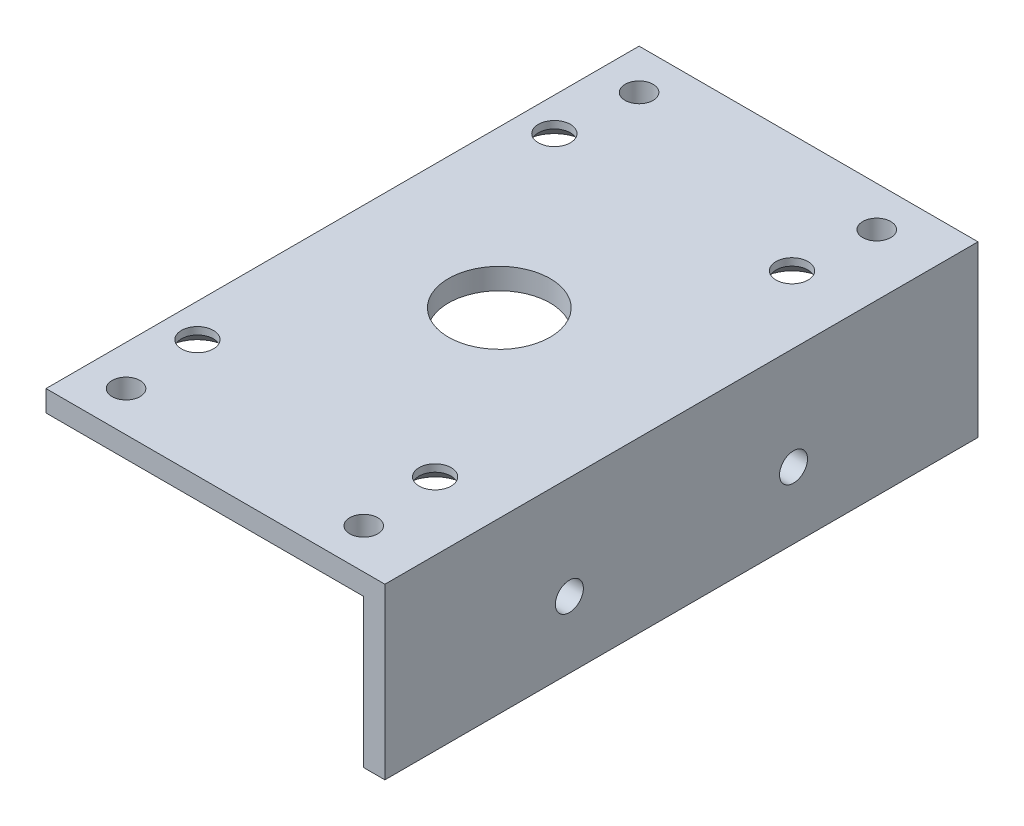
ISO-10303-21;
HEADER;
FILE_DESCRIPTION(('STEP AP214'),'2;1');
FILE_NAME('part.step','',(''),(''),'','','');
FILE_SCHEMA(('AUTOMOTIVE_DESIGN { 1 0 10303 214 1 1 1 1 }'));
ENDSEC;
DATA;
#1=APPLICATION_CONTEXT('core data for automotive mechanical design processes');
#2=APPLICATION_PROTOCOL_DEFINITION('international standard','automotive_design',2000,#1);
#3=PRODUCT_CONTEXT('',#1,'mechanical');
#4=PRODUCT('Part','Part','',(#3));
#5=PRODUCT_RELATED_PRODUCT_CATEGORY('part','',(#4));
#6=PRODUCT_DEFINITION_FORMATION('','',#4);
#7=PRODUCT_DEFINITION_CONTEXT('part definition',#1,'design');
#8=PRODUCT_DEFINITION('design','',#6,#7);
#9=PRODUCT_DEFINITION_SHAPE('','',#8);
#10=(LENGTH_UNIT() NAMED_UNIT(*) SI_UNIT(.MILLI.,.METRE.));
#11=(NAMED_UNIT(*) PLANE_ANGLE_UNIT() SI_UNIT($,.RADIAN.));
#12=(NAMED_UNIT(*) SI_UNIT($,.STERADIAN.) SOLID_ANGLE_UNIT());
#13=UNCERTAINTY_MEASURE_WITH_UNIT(LENGTH_MEASURE(1.E-05),#10,'distance_accuracy_value','');
#14=(GEOMETRIC_REPRESENTATION_CONTEXT(3) GLOBAL_UNCERTAINTY_ASSIGNED_CONTEXT((#13)) GLOBAL_UNIT_ASSIGNED_CONTEXT((#10,
#11,#12)) REPRESENTATION_CONTEXT('',''));
#15=CARTESIAN_POINT('',(0.,0.,0.));
#16=DIRECTION('',(0.,0.,1.));
#17=DIRECTION('',(1.,0.,0.));
#18=AXIS2_PLACEMENT_3D('',#15,#16,#17);
#19=CARTESIAN_POINT('',(-10.175,22.2250000000486,58.5));
#20=DIRECTION('',(0.,-1.,0.));
#21=DIRECTION('',(0.,0.,-1.));
#22=AXIS2_PLACEMENT_3D('',#19,#20,#21);
#23=CONICAL_SURFACE('',#22,4.47999999990634,0.785398163383784);
#24=CARTESIAN_POINT('',(-10.175,24.305,58.5));
#25=DIRECTION('',(0.,-1.,0.));
#26=DIRECTION('',(0.,0.,-1.));
#27=AXIS2_PLACEMENT_3D('',#24,#25,#26);
#28=CIRCLE('',#27,2.4);
#29=CARTESIAN_POINT('',(-10.175,24.305,56.1));
#30=VERTEX_POINT('',#29);
#31=EDGE_CURVE('E114',#30,#30,#28,.F.);
#32=ORIENTED_EDGE('',*,*,#31,.T.);
#33=EDGE_LOOP('',(#32));
#34=FACE_BOUND('',#33,.T.);
#35=CARTESIAN_POINT('',(-10.175,22.2249999999917,58.5));
#36=DIRECTION('',(0.,-1.,0.));
#37=DIRECTION('',(0.,0.,-1.));
#38=AXIS2_PLACEMENT_3D('',#35,#36,#37);
#39=CIRCLE('',#38,4.47999999996319);
#40=CARTESIAN_POINT('',(-10.175,22.2249999999917,54.0200000000368));
#41=VERTEX_POINT('',#40);
#42=EDGE_CURVE('E171',#41,#41,#39,.T.);
#43=ORIENTED_EDGE('',*,*,#42,.T.);
#44=EDGE_LOOP('',(#43));
#45=FACE_BOUND('',#44,.T.);
#46=ADVANCED_FACE('F17',(#34,#45),#23,.F.);
#47=CARTESIAN_POINT('',(-10.175,22.2250000000486,5.));
#48=DIRECTION('',(0.,-1.,0.));
#49=DIRECTION('',(0.,0.,-1.));
#50=AXIS2_PLACEMENT_3D('',#47,#48,#49);
#51=CONICAL_SURFACE('',#50,4.47999999994863,0.785398163397448);
#52=CARTESIAN_POINT('',(-10.175,24.305,5.));
#53=DIRECTION('',(0.,-1.,0.));
#54=DIRECTION('',(0.,0.,-1.));
#55=AXIS2_PLACEMENT_3D('',#52,#53,#54);
#56=CIRCLE('',#55,2.4);
#57=CARTESIAN_POINT('',(-10.175,24.305,2.6));
#58=VERTEX_POINT('',#57);
#59=EDGE_CURVE('E111',#58,#58,#56,.F.);
#60=ORIENTED_EDGE('',*,*,#59,.T.);
#61=EDGE_LOOP('',(#60));
#62=FACE_BOUND('',#61,.T.);
#63=CARTESIAN_POINT('',(-10.175,22.2250000000486,5.));
#64=DIRECTION('',(0.,-1.,0.));
#65=DIRECTION('',(0.,0.,-1.));
#66=AXIS2_PLACEMENT_3D('',#63,#64,#65);
#67=CIRCLE('',#66,4.47999999994863);
#68=CARTESIAN_POINT('',(-10.175,22.2250000000486,0.520000000051368));
#69=VERTEX_POINT('',#68);
#70=EDGE_CURVE('E20',#69,#69,#67,.T.);
#71=ORIENTED_EDGE('',*,*,#70,.T.);
#72=EDGE_LOOP('',(#71));
#73=FACE_BOUND('',#72,.T.);
#74=ADVANCED_FACE('F181',(#62,#73),#51,.F.);
#75=CARTESIAN_POINT('',(-45.8,22.2249999999349,5.));
#76=DIRECTION('',(0.,-1.,0.));
#77=DIRECTION('',(0.,0.,-1.));
#78=AXIS2_PLACEMENT_3D('',#75,#76,#77);
#79=CONICAL_SURFACE('',#78,4.48000000000547,0.785398163397448);
#80=CARTESIAN_POINT('',(-45.8,24.305,5.));
#81=DIRECTION('',(0.,-1.,0.));
#82=DIRECTION('',(0.,0.,-1.));
#83=AXIS2_PLACEMENT_3D('',#80,#81,#82);
#84=CIRCLE('',#83,2.4);
#85=CARTESIAN_POINT('',(-45.8,24.305,2.6));
#86=VERTEX_POINT('',#85);
#87=EDGE_CURVE('E108',#86,#86,#84,.F.);
#88=ORIENTED_EDGE('',*,*,#87,.T.);
#89=EDGE_LOOP('',(#88));
#90=FACE_BOUND('',#89,.T.);
#91=CARTESIAN_POINT('',(-45.8,22.2249999999349,5.));
#92=DIRECTION('',(0.,-1.,0.));
#93=DIRECTION('',(0.,0.,-1.));
#94=AXIS2_PLACEMENT_3D('',#91,#92,#93);
#95=CIRCLE('',#94,4.48000000000547);
#96=CARTESIAN_POINT('',(-45.8,22.2249999999349,0.519999999994525));
#97=VERTEX_POINT('',#96);
#98=EDGE_CURVE('E103',#97,#97,#95,.T.);
#99=ORIENTED_EDGE('',*,*,#98,.T.);
#100=EDGE_LOOP('',(#99));
#101=FACE_BOUND('',#100,.T.);
#102=ADVANCED_FACE('F295',(#90,#101),#79,.F.);
#103=CARTESIAN_POINT('',(-45.8,22.2250000000486,58.5));
#104=DIRECTION('',(0.,-1.,0.));
#105=DIRECTION('',(0.,0.,-1.));
#106=AXIS2_PLACEMENT_3D('',#103,#104,#105);
#107=CONICAL_SURFACE('',#106,4.47999999996319,0.785398163397448);
#108=CARTESIAN_POINT('',(-45.8,24.305,58.5));
#109=DIRECTION('',(0.,-1.,0.));
#110=DIRECTION('',(0.,0.,-1.));
#111=AXIS2_PLACEMENT_3D('',#108,#109,#110);
#112=CIRCLE('',#111,2.4);
#113=CARTESIAN_POINT('',(-45.8,24.305,56.1));
#114=VERTEX_POINT('',#113);
#115=EDGE_CURVE('E105',#114,#114,#112,.F.);
#116=ORIENTED_EDGE('',*,*,#115,.T.);
#117=EDGE_LOOP('',(#116));
#118=FACE_BOUND('',#117,.T.);
#119=CARTESIAN_POINT('',(-45.8,22.2249999999917,58.5));
#120=DIRECTION('',(0.,-1.,0.));
#121=DIRECTION('',(0.,0.,-1.));
#122=AXIS2_PLACEMENT_3D('',#119,#120,#121);
#123=CIRCLE('',#122,4.48000000002003);
#124=CARTESIAN_POINT('',(-45.8,22.2249999999917,54.01999999998));
#125=VERTEX_POINT('',#124);
#126=EDGE_CURVE('E104',#125,#125,#123,.T.);
#127=ORIENTED_EDGE('',*,*,#126,.T.);
#128=EDGE_LOOP('',(#127));
#129=FACE_BOUND('',#128,.T.);
#130=ADVANCED_FACE('F300',(#118,#129),#107,.F.);
#131=CARTESIAN_POINT('',(-3.175,0.,63.5));
#132=DIRECTION('',(1.,0.,0.));
#133=DIRECTION('',(0.,0.,-1.));
#134=AXIS2_PLACEMENT_3D('',#131,#132,#133);
#135=PLANE('',#134);
#136=DIRECTION('',(0.,1.,0.));
#137=VECTOR('',#136,1.);
#138=CARTESIAN_POINT('',(-3.175,0.,-12.7));
#139=LINE('',#138,#137);
#140=CARTESIAN_POINT('',(-3.175,0.,-12.7));
#141=VERTEX_POINT('',#140);
#142=CARTESIAN_POINT('',(-3.175,22.225,-12.7));
#143=VERTEX_POINT('',#142);
#144=EDGE_CURVE('E88',#141,#143,#139,.T.);
#145=ORIENTED_EDGE('',*,*,#144,.F.);
#146=DIRECTION('',(0.,0.,1.));
#147=VECTOR('',#146,1.);
#148=CARTESIAN_POINT('',(-3.175,0.,63.5));
#149=LINE('',#148,#147);
#150=CARTESIAN_POINT('',(-3.175,0.,76.2));
#151=VERTEX_POINT('',#150);
#152=EDGE_CURVE('E85',#141,#151,#149,.T.);
#153=ORIENTED_EDGE('',*,*,#152,.T.);
#154=DIRECTION('',(0.,1.,0.));
#155=VECTOR('',#154,1.);
#156=CARTESIAN_POINT('',(-3.175,0.,76.2));
#157=LINE('',#156,#155);
#158=CARTESIAN_POINT('',(-3.175,22.225,76.2));
#159=VERTEX_POINT('',#158);
#160=EDGE_CURVE('E72',#159,#151,#157,.F.);
#161=ORIENTED_EDGE('',*,*,#160,.F.);
#162=DIRECTION('',(0.,0.,1.));
#163=VECTOR('',#162,1.);
#164=CARTESIAN_POINT('',(-3.175,22.225,63.5));
#165=LINE('',#164,#163);
#166=EDGE_CURVE('E67',#159,#143,#165,.F.);
#167=ORIENTED_EDGE('',*,*,#166,.T.);
#168=EDGE_LOOP('',(#145,#153,#161,#167));
#169=FACE_BOUND('',#168,.T.);
#170=CARTESIAN_POINT('',(-3.175,10.,14.95));
#171=DIRECTION('',(-1.,0.,0.));
#172=DIRECTION('',(0.,0.,1.));
#173=AXIS2_PLACEMENT_3D('',#170,#171,#172);
#174=CIRCLE('',#173,2.1);
#175=CARTESIAN_POINT('',(-3.175,10.,17.05));
#176=VERTEX_POINT('',#175);
#177=EDGE_CURVE('E92',#176,#176,#174,.F.);
#178=ORIENTED_EDGE('',*,*,#177,.T.);
#179=EDGE_LOOP('',(#178));
#180=FACE_BOUND('',#179,.T.);
#181=CARTESIAN_POINT('',(-3.175,10.,48.55));
#182=DIRECTION('',(-1.,0.,0.));
#183=DIRECTION('',(0.,0.,1.));
#184=AXIS2_PLACEMENT_3D('',#181,#182,#183);
#185=CIRCLE('',#184,2.1);
#186=CARTESIAN_POINT('',(-3.175,10.,50.65));
#187=VERTEX_POINT('',#186);
#188=EDGE_CURVE('E168',#187,#187,#185,.F.);
#189=ORIENTED_EDGE('',*,*,#188,.T.);
#190=EDGE_LOOP('',(#189));
#191=FACE_BOUND('',#190,.T.);
#192=ADVANCED_FACE('F86',(#169,#180,#191),#135,.F.);
#193=CARTESIAN_POINT('',(-3.175,22.225,63.5));
#194=DIRECTION('',(0.,1.,0.));
#195=DIRECTION('',(-1.,0.,0.));
#196=AXIS2_PLACEMENT_3D('',#193,#194,#195);
#197=PLANE('',#196);
#198=CARTESIAN_POINT('',(-44.8,22.225,-6.69999999999997));
#199=DIRECTION('',(0.,-1.,0.));
#200=DIRECTION('',(0.,0.,-1.));
#201=AXIS2_PLACEMENT_3D('',#198,#199,#200);
#202=CIRCLE('',#201,2.1);
#203=CARTESIAN_POINT('',(-44.8,22.225,-8.79999999999997));
#204=VERTEX_POINT('',#203);
#205=EDGE_CURVE('E91',#204,#204,#202,.F.);
#206=ORIENTED_EDGE('',*,*,#205,.T.);
#207=EDGE_LOOP('',(#206));
#208=FACE_BOUND('',#207,.T.);
#209=CARTESIAN_POINT('',(-9.17500000000002,22.225,70.2));
#210=DIRECTION('',(0.,-1.,0.));
#211=DIRECTION('',(0.,0.,-1.));
#212=AXIS2_PLACEMENT_3D('',#209,#210,#211);
#213=CIRCLE('',#212,2.1);
#214=CARTESIAN_POINT('',(-9.17500000000002,22.225,68.1));
#215=VERTEX_POINT('',#214);
#216=EDGE_CURVE('E158',#215,#215,#213,.F.);
#217=ORIENTED_EDGE('',*,*,#216,.T.);
#218=EDGE_LOOP('',(#217));
#219=FACE_BOUND('',#218,.T.);
#220=ORIENTED_EDGE('',*,*,#42,.F.);
#221=EDGE_LOOP('',(#220));
#222=FACE_BOUND('',#221,.T.);
#223=ORIENTED_EDGE('',*,*,#98,.F.);
#224=EDGE_LOOP('',(#223));
#225=FACE_BOUND('',#224,.T.);
#226=DIRECTION('',(-1.,0.,0.));
#227=VECTOR('',#226,1.);
#228=CARTESIAN_POINT('',(0.,22.225,-12.7));
#229=LINE('',#228,#227);
#230=CARTESIAN_POINT('',(-50.8,22.225,-12.7));
#231=VERTEX_POINT('',#230);
#232=EDGE_CURVE('E274',#143,#231,#229,.T.);
#233=ORIENTED_EDGE('',*,*,#232,.F.);
#234=ORIENTED_EDGE('',*,*,#166,.F.);
#235=DIRECTION('',(1.,0.,0.));
#236=VECTOR('',#235,1.);
#237=CARTESIAN_POINT('',(0.,22.225,76.2));
#238=LINE('',#237,#236);
#239=CARTESIAN_POINT('',(-50.8,22.225,76.2));
#240=VERTEX_POINT('',#239);
#241=EDGE_CURVE('E80',#240,#159,#238,.T.);
#242=ORIENTED_EDGE('',*,*,#241,.F.);
#243=DIRECTION('',(0.,0.,-1.));
#244=VECTOR('',#243,1.);
#245=CARTESIAN_POINT('',(-50.8,22.225,63.5));
#246=LINE('',#245,#244);
#247=EDGE_CURVE('E469',#240,#231,#246,.T.);
#248=ORIENTED_EDGE('',*,*,#247,.T.);
#249=EDGE_LOOP('',(#233,#234,#242,#248));
#250=FACE_BOUND('',#249,.T.);
#251=CARTESIAN_POINT('',(-27.305,22.225,31.75));
#252=DIRECTION('',(0.,-1.,0.));
#253=DIRECTION('',(1.,0.,0.));
#254=AXIS2_PLACEMENT_3D('',#251,#252,#253);
#255=CIRCLE('',#254,7.61999999999999);
#256=CARTESIAN_POINT('',(-19.685,22.225,31.75));
#257=VERTEX_POINT('',#256);
#258=EDGE_CURVE('E82',#257,#257,#255,.F.);
#259=ORIENTED_EDGE('',*,*,#258,.T.);
#260=EDGE_LOOP('',(#259));
#261=FACE_BOUND('',#260,.T.);
#262=ORIENTED_EDGE('',*,*,#126,.F.);
#263=EDGE_LOOP('',(#262));
#264=FACE_BOUND('',#263,.T.);
#265=ORIENTED_EDGE('',*,*,#70,.F.);
#266=EDGE_LOOP('',(#265));
#267=FACE_BOUND('',#266,.T.);
#268=CARTESIAN_POINT('',(-9.17500000000001,22.225,-6.69999999999995));
#269=DIRECTION('',(0.,-1.,0.));
#270=DIRECTION('',(0.,0.,-1.));
#271=AXIS2_PLACEMENT_3D('',#268,#269,#270);
#272=CIRCLE('',#271,2.1);
#273=CARTESIAN_POINT('',(-9.17500000000001,22.225,-8.79999999999995));
#274=VERTEX_POINT('',#273);
#275=EDGE_CURVE('E117',#274,#274,#272,.F.);
#276=ORIENTED_EDGE('',*,*,#275,.T.);
#277=EDGE_LOOP('',(#276));
#278=FACE_BOUND('',#277,.T.);
#279=CARTESIAN_POINT('',(-44.8,22.225,70.2));
#280=DIRECTION('',(0.,-1.,0.));
#281=DIRECTION('',(0.,0.,-1.));
#282=AXIS2_PLACEMENT_3D('',#279,#280,#281);
#283=CIRCLE('',#282,2.1);
#284=CARTESIAN_POINT('',(-44.8,22.225,68.1));
#285=VERTEX_POINT('',#284);
#286=EDGE_CURVE('E161',#285,#285,#283,.F.);
#287=ORIENTED_EDGE('',*,*,#286,.T.);
#288=EDGE_LOOP('',(#287));
#289=FACE_BOUND('',#288,.T.);
#290=ADVANCED_FACE('F183',(#208,#219,#222,#225,#250,#261,#264,#267,#278,#289),#197,.F.);
#291=CARTESIAN_POINT('',(-3.175,10.,48.55));
#292=DIRECTION('',(-1.,0.,0.));
#293=DIRECTION('',(0.,0.,1.));
#294=AXIS2_PLACEMENT_3D('',#291,#292,#293);
#295=CYLINDRICAL_SURFACE('',#294,2.1);
#296=CARTESIAN_POINT('',(0.,10.,48.55));
#297=DIRECTION('',(-1.,0.,0.));
#298=DIRECTION('',(0.,0.,1.));
#299=AXIS2_PLACEMENT_3D('',#296,#297,#298);
#300=CIRCLE('',#299,2.1);
#301=CARTESIAN_POINT('',(0.,10.,50.65));
#302=VERTEX_POINT('',#301);
#303=EDGE_CURVE('E150',#302,#302,#300,.F.);
#304=ORIENTED_EDGE('',*,*,#303,.T.);
#305=EDGE_LOOP('',(#304));
#306=FACE_BOUND('',#305,.T.);
#307=ORIENTED_EDGE('',*,*,#188,.F.);
#308=EDGE_LOOP('',(#307));
#309=FACE_BOUND('',#308,.T.);
#310=ADVANCED_FACE('F186',(#306,#309),#295,.F.);
#311=CARTESIAN_POINT('',(-3.175,10.,14.95));
#312=DIRECTION('',(-1.,0.,0.));
#313=DIRECTION('',(0.,0.,1.));
#314=AXIS2_PLACEMENT_3D('',#311,#312,#313);
#315=CYLINDRICAL_SURFACE('',#314,2.1);
#316=CARTESIAN_POINT('',(0.,10.,14.95));
#317=DIRECTION('',(-1.,0.,0.));
#318=DIRECTION('',(0.,0.,1.));
#319=AXIS2_PLACEMENT_3D('',#316,#317,#318);
#320=CIRCLE('',#319,2.1);
#321=CARTESIAN_POINT('',(0.,10.,17.05));
#322=VERTEX_POINT('',#321);
#323=EDGE_CURVE('E146',#322,#322,#320,.F.);
#324=ORIENTED_EDGE('',*,*,#323,.T.);
#325=EDGE_LOOP('',(#324));
#326=FACE_BOUND('',#325,.T.);
#327=ORIENTED_EDGE('',*,*,#177,.F.);
#328=EDGE_LOOP('',(#327));
#329=FACE_BOUND('',#328,.T.);
#330=ADVANCED_FACE('F311',(#326,#329),#315,.F.);
#331=CARTESIAN_POINT('',(0.,0.,63.5));
#332=DIRECTION('',(0.,1.,0.));
#333=DIRECTION('',(-1.,0.,0.));
#334=AXIS2_PLACEMENT_3D('',#331,#332,#333);
#335=PLANE('',#334);
#336=DIRECTION('',(-1.,0.,0.));
#337=VECTOR('',#336,1.);
#338=CARTESIAN_POINT('',(0.,0.,-12.7));
#339=LINE('',#338,#337);
#340=CARTESIAN_POINT('',(0.,0.,-12.7));
#341=VERTEX_POINT('',#340);
#342=EDGE_CURVE('E473',#341,#141,#339,.T.);
#343=ORIENTED_EDGE('',*,*,#342,.F.);
#344=DIRECTION('',(0.,0.,1.));
#345=VECTOR('',#344,1.);
#346=CARTESIAN_POINT('',(0.,0.,63.5));
#347=LINE('',#346,#345);
#348=CARTESIAN_POINT('',(0.,0.,76.2));
#349=VERTEX_POINT('',#348);
#350=EDGE_CURVE('E96',#341,#349,#347,.T.);
#351=ORIENTED_EDGE('',*,*,#350,.T.);
#352=DIRECTION('',(1.,0.,0.));
#353=VECTOR('',#352,1.);
#354=CARTESIAN_POINT('',(0.,0.,76.2));
#355=LINE('',#354,#353);
#356=EDGE_CURVE('E78',#151,#349,#355,.T.);
#357=ORIENTED_EDGE('',*,*,#356,.F.);
#358=ORIENTED_EDGE('',*,*,#152,.F.);
#359=EDGE_LOOP('',(#343,#351,#357,#358));
#360=FACE_BOUND('',#359,.T.);
#361=ADVANCED_FACE('F95',(#360),#335,.F.);
#362=CARTESIAN_POINT('',(-44.8,22.225,-6.69999999999997));
#363=DIRECTION('',(0.,-1.,0.));
#364=DIRECTION('',(0.,0.,-1.));
#365=AXIS2_PLACEMENT_3D('',#362,#363,#364);
#366=CYLINDRICAL_SURFACE('',#365,2.1);
#367=CARTESIAN_POINT('',(-44.8,25.4,-6.69999999999997));
#368=DIRECTION('',(0.,-1.,0.));
#369=DIRECTION('',(0.,0.,-1.));
#370=AXIS2_PLACEMENT_3D('',#367,#368,#369);
#371=CIRCLE('',#370,2.1);
#372=CARTESIAN_POINT('',(-44.8,25.4,-8.79999999999997));
#373=VERTEX_POINT('',#372);
#374=EDGE_CURVE('E143',#373,#373,#371,.F.);
#375=ORIENTED_EDGE('',*,*,#374,.T.);
#376=EDGE_LOOP('',(#375));
#377=FACE_BOUND('',#376,.T.);
#378=ORIENTED_EDGE('',*,*,#205,.F.);
#379=EDGE_LOOP('',(#378));
#380=FACE_BOUND('',#379,.T.);
#381=ADVANCED_FACE('F196',(#377,#380),#366,.F.);
#382=CARTESIAN_POINT('',(-44.8,22.225,70.2));
#383=DIRECTION('',(0.,-1.,0.));
#384=DIRECTION('',(0.,0.,-1.));
#385=AXIS2_PLACEMENT_3D('',#382,#383,#384);
#386=CYLINDRICAL_SURFACE('',#385,2.1);
#387=CARTESIAN_POINT('',(-44.8,25.4,70.2));
#388=DIRECTION('',(0.,-1.,0.));
#389=DIRECTION('',(0.,0.,-1.));
#390=AXIS2_PLACEMENT_3D('',#387,#388,#389);
#391=CIRCLE('',#390,2.1);
#392=CARTESIAN_POINT('',(-44.8,25.4,68.1));
#393=VERTEX_POINT('',#392);
#394=EDGE_CURVE('E140',#393,#393,#391,.F.);
#395=ORIENTED_EDGE('',*,*,#394,.T.);
#396=EDGE_LOOP('',(#395));
#397=FACE_BOUND('',#396,.T.);
#398=ORIENTED_EDGE('',*,*,#286,.F.);
#399=EDGE_LOOP('',(#398));
#400=FACE_BOUND('',#399,.T.);
#401=ADVANCED_FACE('F193',(#397,#400),#386,.F.);
#402=CARTESIAN_POINT('',(-9.17500000000002,22.225,70.2));
#403=DIRECTION('',(0.,-1.,0.));
#404=DIRECTION('',(0.,0.,-1.));
#405=AXIS2_PLACEMENT_3D('',#402,#403,#404);
#406=CYLINDRICAL_SURFACE('',#405,2.1);
#407=CARTESIAN_POINT('',(-9.17500000000002,25.4,70.2));
#408=DIRECTION('',(0.,-1.,0.));
#409=DIRECTION('',(0.,0.,-1.));
#410=AXIS2_PLACEMENT_3D('',#407,#408,#409);
#411=CIRCLE('',#410,2.1);
#412=CARTESIAN_POINT('',(-9.17500000000002,25.4,68.1));
#413=VERTEX_POINT('',#412);
#414=EDGE_CURVE('E137',#413,#413,#411,.F.);
#415=ORIENTED_EDGE('',*,*,#414,.T.);
#416=EDGE_LOOP('',(#415));
#417=FACE_BOUND('',#416,.T.);
#418=ORIENTED_EDGE('',*,*,#216,.F.);
#419=EDGE_LOOP('',(#418));
#420=FACE_BOUND('',#419,.T.);
#421=ADVANCED_FACE('F195',(#417,#420),#406,.F.);
#422=CARTESIAN_POINT('',(-9.17500000000001,22.225,-6.69999999999995));
#423=DIRECTION('',(0.,-1.,0.));
#424=DIRECTION('',(0.,0.,-1.));
#425=AXIS2_PLACEMENT_3D('',#422,#423,#424);
#426=CYLINDRICAL_SURFACE('',#425,2.1);
#427=CARTESIAN_POINT('',(-9.17500000000001,25.4,-6.69999999999995));
#428=DIRECTION('',(0.,-1.,0.));
#429=DIRECTION('',(0.,0.,-1.));
#430=AXIS2_PLACEMENT_3D('',#427,#428,#429);
#431=CIRCLE('',#430,2.1);
#432=CARTESIAN_POINT('',(-9.17500000000001,25.4,-8.79999999999995));
#433=VERTEX_POINT('',#432);
#434=EDGE_CURVE('E134',#433,#433,#431,.F.);
#435=ORIENTED_EDGE('',*,*,#434,.T.);
#436=EDGE_LOOP('',(#435));
#437=FACE_BOUND('',#436,.T.);
#438=ORIENTED_EDGE('',*,*,#275,.F.);
#439=EDGE_LOOP('',(#438));
#440=FACE_BOUND('',#439,.T.);
#441=ADVANCED_FACE('F204',(#437,#440),#426,.F.);
#442=CARTESIAN_POINT('',(-10.175,22.225,58.5));
#443=DIRECTION('',(0.,-1.,0.));
#444=DIRECTION('',(0.,0.,-1.));
#445=AXIS2_PLACEMENT_3D('',#442,#443,#444);
#446=CYLINDRICAL_SURFACE('',#445,2.4);
#447=CARTESIAN_POINT('',(-10.175,25.4,58.5));
#448=DIRECTION('',(0.,-1.,0.));
#449=DIRECTION('',(0.,0.,-1.));
#450=AXIS2_PLACEMENT_3D('',#447,#448,#449);
#451=CIRCLE('',#450,2.4);
#452=CARTESIAN_POINT('',(-10.175,25.4,56.1));
#453=VERTEX_POINT('',#452);
#454=EDGE_CURVE('E131',#453,#453,#451,.F.);
#455=ORIENTED_EDGE('',*,*,#454,.T.);
#456=EDGE_LOOP('',(#455));
#457=FACE_BOUND('',#456,.T.);
#458=ORIENTED_EDGE('',*,*,#31,.F.);
#459=EDGE_LOOP('',(#458));
#460=FACE_BOUND('',#459,.T.);
#461=ADVANCED_FACE('F246',(#457,#460),#446,.F.);
#462=CARTESIAN_POINT('',(-10.175,22.225,5.));
#463=DIRECTION('',(0.,-1.,0.));
#464=DIRECTION('',(0.,0.,-1.));
#465=AXIS2_PLACEMENT_3D('',#462,#463,#464);
#466=CYLINDRICAL_SURFACE('',#465,2.4);
#467=CARTESIAN_POINT('',(-10.175,25.4,5.));
#468=DIRECTION('',(0.,-1.,0.));
#469=DIRECTION('',(0.,0.,-1.));
#470=AXIS2_PLACEMENT_3D('',#467,#468,#469);
#471=CIRCLE('',#470,2.4);
#472=CARTESIAN_POINT('',(-10.175,25.4,2.6));
#473=VERTEX_POINT('',#472);
#474=EDGE_CURVE('E128',#473,#473,#471,.F.);
#475=ORIENTED_EDGE('',*,*,#474,.T.);
#476=EDGE_LOOP('',(#475));
#477=FACE_BOUND('',#476,.T.);
#478=ORIENTED_EDGE('',*,*,#59,.F.);
#479=EDGE_LOOP('',(#478));
#480=FACE_BOUND('',#479,.T.);
#481=ADVANCED_FACE('F242',(#477,#480),#466,.F.);
#482=CARTESIAN_POINT('',(-45.8,22.225,5.));
#483=DIRECTION('',(0.,-1.,0.));
#484=DIRECTION('',(0.,0.,-1.));
#485=AXIS2_PLACEMENT_3D('',#482,#483,#484);
#486=CYLINDRICAL_SURFACE('',#485,2.4);
#487=CARTESIAN_POINT('',(-45.8,25.4,5.));
#488=DIRECTION('',(0.,-1.,0.));
#489=DIRECTION('',(0.,0.,-1.));
#490=AXIS2_PLACEMENT_3D('',#487,#488,#489);
#491=CIRCLE('',#490,2.4);
#492=CARTESIAN_POINT('',(-45.8,25.4,2.6));
#493=VERTEX_POINT('',#492);
#494=EDGE_CURVE('E125',#493,#493,#491,.F.);
#495=ORIENTED_EDGE('',*,*,#494,.T.);
#496=EDGE_LOOP('',(#495));
#497=FACE_BOUND('',#496,.T.);
#498=ORIENTED_EDGE('',*,*,#87,.F.);
#499=EDGE_LOOP('',(#498));
#500=FACE_BOUND('',#499,.T.);
#501=ADVANCED_FACE('F238',(#497,#500),#486,.F.);
#502=CARTESIAN_POINT('',(-45.8,22.225,58.5));
#503=DIRECTION('',(0.,-1.,0.));
#504=DIRECTION('',(0.,0.,-1.));
#505=AXIS2_PLACEMENT_3D('',#502,#503,#504);
#506=CYLINDRICAL_SURFACE('',#505,2.4);
#507=CARTESIAN_POINT('',(-45.8,25.4,58.5));
#508=DIRECTION('',(0.,-1.,0.));
#509=DIRECTION('',(0.,0.,-1.));
#510=AXIS2_PLACEMENT_3D('',#507,#508,#509);
#511=CIRCLE('',#510,2.4);
#512=CARTESIAN_POINT('',(-45.8,25.4,56.1));
#513=VERTEX_POINT('',#512);
#514=EDGE_CURVE('E122',#513,#513,#511,.F.);
#515=ORIENTED_EDGE('',*,*,#514,.T.);
#516=EDGE_LOOP('',(#515));
#517=FACE_BOUND('',#516,.T.);
#518=ORIENTED_EDGE('',*,*,#115,.F.);
#519=EDGE_LOOP('',(#518));
#520=FACE_BOUND('',#519,.T.);
#521=ADVANCED_FACE('F234',(#517,#520),#506,.F.);
#522=CARTESIAN_POINT('',(-27.305,25.401,31.75));
#523=DIRECTION('',(0.,-1.,0.));
#524=DIRECTION('',(1.,0.,0.));
#525=AXIS2_PLACEMENT_3D('',#522,#523,#524);
#526=CYLINDRICAL_SURFACE('',#525,7.61999999999999);
#527=ORIENTED_EDGE('',*,*,#258,.F.);
#528=EDGE_LOOP('',(#527));
#529=FACE_BOUND('',#528,.T.);
#530=CARTESIAN_POINT('',(-27.305,25.4,31.75));
#531=DIRECTION('',(0.,-1.,0.));
#532=DIRECTION('',(1.,0.,0.));
#533=AXIS2_PLACEMENT_3D('',#530,#531,#532);
#534=CIRCLE('',#533,7.61999999999999);
#535=CARTESIAN_POINT('',(-19.685,25.4,31.75));
#536=VERTEX_POINT('',#535);
#537=EDGE_CURVE('E118',#536,#536,#534,.F.);
#538=ORIENTED_EDGE('',*,*,#537,.T.);
#539=EDGE_LOOP('',(#538));
#540=FACE_BOUND('',#539,.T.);
#541=ADVANCED_FACE('F231',(#529,#540),#526,.F.);
#542=CARTESIAN_POINT('',(0.,0.,76.2));
#543=DIRECTION('',(0.,0.,1.));
#544=DIRECTION('',(1.,0.,0.));
#545=AXIS2_PLACEMENT_3D('',#542,#543,#544);
#546=PLANE('',#545);
#547=DIRECTION('',(0.,1.,0.));
#548=VECTOR('',#547,1.);
#549=CARTESIAN_POINT('',(-50.8,25.4,76.2));
#550=LINE('',#549,#548);
#551=CARTESIAN_POINT('',(-50.8,25.4,76.2));
#552=VERTEX_POINT('',#551);
#553=EDGE_CURVE('E98',#552,#240,#550,.F.);
#554=ORIENTED_EDGE('',*,*,#553,.T.);
#555=ORIENTED_EDGE('',*,*,#241,.T.);
#556=ORIENTED_EDGE('',*,*,#160,.T.);
#557=ORIENTED_EDGE('',*,*,#356,.T.);
#558=DIRECTION('',(0.,1.,0.));
#559=VECTOR('',#558,1.);
#560=CARTESIAN_POINT('',(0.,0.,76.2));
#561=LINE('',#560,#559);
#562=CARTESIAN_POINT('',(0.,25.4,76.2));
#563=VERTEX_POINT('',#562);
#564=EDGE_CURVE('E149',#349,#563,#561,.T.);
#565=ORIENTED_EDGE('',*,*,#564,.T.);
#566=DIRECTION('',(1.,0.,0.));
#567=VECTOR('',#566,1.);
#568=CARTESIAN_POINT('',(0.,25.4,76.2));
#569=LINE('',#568,#567);
#570=EDGE_CURVE('E121',#563,#552,#569,.F.);
#571=ORIENTED_EDGE('',*,*,#570,.T.);
#572=EDGE_LOOP('',(#554,#555,#556,#557,#565,#571));
#573=FACE_BOUND('',#572,.T.);
#574=ADVANCED_FACE('F75',(#573),#546,.T.);
#575=CARTESIAN_POINT('',(-50.8,25.4,63.5));
#576=DIRECTION('',(1.,0.,0.));
#577=DIRECTION('',(0.,0.,-1.));
#578=AXIS2_PLACEMENT_3D('',#575,#576,#577);
#579=PLANE('',#578);
#580=DIRECTION('',(0.,1.,0.));
#581=VECTOR('',#580,1.);
#582=CARTESIAN_POINT('',(-50.8,0.,-12.7));
#583=LINE('',#582,#581);
#584=CARTESIAN_POINT('',(-50.8,25.4,-12.7));
#585=VERTEX_POINT('',#584);
#586=EDGE_CURVE('E153',#231,#585,#583,.T.);
#587=ORIENTED_EDGE('',*,*,#586,.F.);
#588=ORIENTED_EDGE('',*,*,#247,.F.);
#589=ORIENTED_EDGE('',*,*,#553,.F.);
#590=DIRECTION('',(0.,0.,1.));
#591=VECTOR('',#590,1.);
#592=CARTESIAN_POINT('',(-50.8,25.4,63.5));
#593=LINE('',#592,#591);
#594=EDGE_CURVE('E481',#552,#585,#593,.F.);
#595=ORIENTED_EDGE('',*,*,#594,.T.);
#596=EDGE_LOOP('',(#587,#588,#589,#595));
#597=FACE_BOUND('',#596,.T.);
#598=ADVANCED_FACE('F224',(#597),#579,.F.);
#599=CARTESIAN_POINT('',(0.,0.,-12.7));
#600=DIRECTION('',(0.,0.,-1.));
#601=DIRECTION('',(-1.,0.,0.));
#602=AXIS2_PLACEMENT_3D('',#599,#600,#601);
#603=PLANE('',#602);
#604=ORIENTED_EDGE('',*,*,#586,.T.);
#605=DIRECTION('',(1.,0.,0.));
#606=VECTOR('',#605,1.);
#607=CARTESIAN_POINT('',(0.,25.4,-12.7));
#608=LINE('',#607,#606);
#609=CARTESIAN_POINT('',(0.,25.4,-12.7));
#610=VERTEX_POINT('',#609);
#611=EDGE_CURVE('E26',#585,#610,#608,.T.);
#612=ORIENTED_EDGE('',*,*,#611,.T.);
#613=DIRECTION('',(0.,1.,0.));
#614=VECTOR('',#613,1.);
#615=CARTESIAN_POINT('',(0.,0.,-12.7));
#616=LINE('',#615,#614);
#617=EDGE_CURVE('E34',#610,#341,#616,.F.);
#618=ORIENTED_EDGE('',*,*,#617,.T.);
#619=ORIENTED_EDGE('',*,*,#342,.T.);
#620=ORIENTED_EDGE('',*,*,#144,.T.);
#621=ORIENTED_EDGE('',*,*,#232,.T.);
#622=EDGE_LOOP('',(#604,#612,#618,#619,#620,#621));
#623=FACE_BOUND('',#622,.T.);
#624=ADVANCED_FACE('F217',(#623),#603,.T.);
#625=CARTESIAN_POINT('',(0.,0.,63.5));
#626=DIRECTION('',(-1.,0.,0.));
#627=DIRECTION('',(0.,0.,1.));
#628=AXIS2_PLACEMENT_3D('',#625,#626,#627);
#629=PLANE('',#628);
#630=ORIENTED_EDGE('',*,*,#617,.F.);
#631=DIRECTION('',(0.,0.,1.));
#632=VECTOR('',#631,1.);
#633=CARTESIAN_POINT('',(0.,25.4,63.5));
#634=LINE('',#633,#632);
#635=EDGE_CURVE('E11',#610,#563,#634,.T.);
#636=ORIENTED_EDGE('',*,*,#635,.T.);
#637=ORIENTED_EDGE('',*,*,#564,.F.);
#638=ORIENTED_EDGE('',*,*,#350,.F.);
#639=EDGE_LOOP('',(#630,#636,#637,#638));
#640=FACE_BOUND('',#639,.T.);
#641=ORIENTED_EDGE('',*,*,#323,.F.);
#642=EDGE_LOOP('',(#641));
#643=FACE_BOUND('',#642,.T.);
#644=ORIENTED_EDGE('',*,*,#303,.F.);
#645=EDGE_LOOP('',(#644));
#646=FACE_BOUND('',#645,.T.);
#647=ADVANCED_FACE('F211',(#640,#643,#646),#629,.F.);
#648=CARTESIAN_POINT('',(0.,25.4,63.5));
#649=DIRECTION('',(0.,-1.,0.));
#650=DIRECTION('',(1.,0.,0.));
#651=AXIS2_PLACEMENT_3D('',#648,#649,#650);
#652=PLANE('',#651);
#653=ORIENTED_EDGE('',*,*,#611,.F.);
#654=ORIENTED_EDGE('',*,*,#594,.F.);
#655=ORIENTED_EDGE('',*,*,#570,.F.);
#656=ORIENTED_EDGE('',*,*,#635,.F.);
#657=EDGE_LOOP('',(#653,#654,#655,#656));
#658=FACE_BOUND('',#657,.T.);
#659=ORIENTED_EDGE('',*,*,#537,.F.);
#660=EDGE_LOOP('',(#659));
#661=FACE_BOUND('',#660,.T.);
#662=ORIENTED_EDGE('',*,*,#514,.F.);
#663=EDGE_LOOP('',(#662));
#664=FACE_BOUND('',#663,.T.);
#665=ORIENTED_EDGE('',*,*,#494,.F.);
#666=EDGE_LOOP('',(#665));
#667=FACE_BOUND('',#666,.T.);
#668=ORIENTED_EDGE('',*,*,#474,.F.);
#669=EDGE_LOOP('',(#668));
#670=FACE_BOUND('',#669,.T.);
#671=ORIENTED_EDGE('',*,*,#454,.F.);
#672=EDGE_LOOP('',(#671));
#673=FACE_BOUND('',#672,.T.);
#674=ORIENTED_EDGE('',*,*,#434,.F.);
#675=EDGE_LOOP('',(#674));
#676=FACE_BOUND('',#675,.T.);
#677=ORIENTED_EDGE('',*,*,#414,.F.);
#678=EDGE_LOOP('',(#677));
#679=FACE_BOUND('',#678,.T.);
#680=ORIENTED_EDGE('',*,*,#394,.F.);
#681=EDGE_LOOP('',(#680));
#682=FACE_BOUND('',#681,.T.);
#683=ORIENTED_EDGE('',*,*,#374,.F.);
#684=EDGE_LOOP('',(#683));
#685=FACE_BOUND('',#684,.T.);
#686=ADVANCED_FACE('F209',(#658,#661,#664,#667,#670,#673,#676,#679,#682,#685),#652,.F.);
#687=CLOSED_SHELL('',(#46,#74,#102,#130,#192,#290,#310,#330,#361,#381,#401,#421,#441,#461,#481,
#501,#521,#541,#574,#598,#624,#647,#686));
#688=MANIFOLD_SOLID_BREP('B1',#687);
#689=ADVANCED_BREP_SHAPE_REPRESENTATION('',(#18,#688),#14);
#690=SHAPE_DEFINITION_REPRESENTATION(#9,#689);
ENDSEC;
END-ISO-10303-21;
